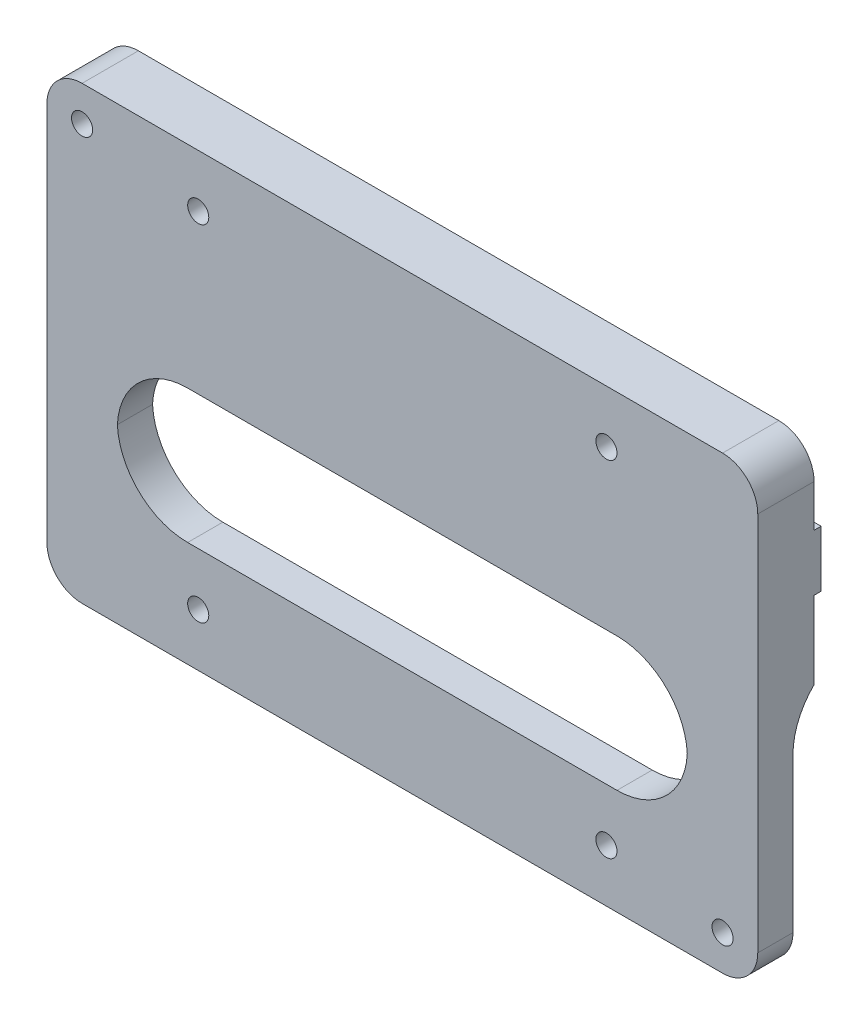
ISO-10303-21;
HEADER;
FILE_DESCRIPTION(('STEP AP214'),'2;1');
FILE_NAME('part.step','',(''),(''),'','','');
FILE_SCHEMA(('AUTOMOTIVE_DESIGN { 1 0 10303 214 1 1 1 1 }'));
ENDSEC;
DATA;
#1=APPLICATION_CONTEXT('core data for automotive mechanical design processes');
#2=APPLICATION_PROTOCOL_DEFINITION('international standard','automotive_design',2000,#1);
#3=PRODUCT_CONTEXT('',#1,'mechanical');
#4=PRODUCT('Part','Part','',(#3));
#5=PRODUCT_RELATED_PRODUCT_CATEGORY('part','',(#4));
#6=PRODUCT_DEFINITION_FORMATION('','',#4);
#7=PRODUCT_DEFINITION_CONTEXT('part definition',#1,'design');
#8=PRODUCT_DEFINITION('design','',#6,#7);
#9=PRODUCT_DEFINITION_SHAPE('','',#8);
#10=(LENGTH_UNIT() NAMED_UNIT(*) SI_UNIT(.MILLI.,.METRE.));
#11=(NAMED_UNIT(*) PLANE_ANGLE_UNIT() SI_UNIT($,.RADIAN.));
#12=(NAMED_UNIT(*) SI_UNIT($,.STERADIAN.) SOLID_ANGLE_UNIT());
#13=UNCERTAINTY_MEASURE_WITH_UNIT(LENGTH_MEASURE(1.E-05),#10,'distance_accuracy_value','');
#14=(GEOMETRIC_REPRESENTATION_CONTEXT(3) GLOBAL_UNCERTAINTY_ASSIGNED_CONTEXT((#13)) GLOBAL_UNIT_ASSIGNED_CONTEXT((#10,
#11,#12)) REPRESENTATION_CONTEXT('',''));
#15=CARTESIAN_POINT('',(0.,0.,0.));
#16=DIRECTION('',(0.,0.,1.));
#17=DIRECTION('',(1.,0.,0.));
#18=AXIS2_PLACEMENT_3D('',#15,#16,#17);
#19=CARTESIAN_POINT('',(0.,0.,0.));
#20=DIRECTION('',(0.,0.,-1.));
#21=DIRECTION('',(-1.,0.,0.));
#22=AXIS2_PLACEMENT_3D('',#19,#20,#21);
#23=PLANE('',#22);
#24=DIRECTION('',(0.,1.,0.));
#25=VECTOR('',#24,1.);
#26=CARTESIAN_POINT('',(50.5,-32.,0.));
#27=LINE('',#26,#25);
#28=CARTESIAN_POINT('',(50.5,2.,0.));
#29=VERTEX_POINT('',#28);
#30=CARTESIAN_POINT('',(50.5,13.,0.));
#31=VERTEX_POINT('',#30);
#32=EDGE_CURVE('E506',#29,#31,#27,.T.);
#33=ORIENTED_EDGE('',*,*,#32,.F.);
#34=DIRECTION('',(1.,0.,0.));
#35=VECTOR('',#34,1.);
#36=CARTESIAN_POINT('',(-40.5,2.,0.));
#37=LINE('',#36,#35);
#38=CARTESIAN_POINT('',(30.5,1.99999999999999,0.));
#39=VERTEX_POINT('',#38);
#40=EDGE_CURVE('E202',#39,#29,#37,.T.);
#41=ORIENTED_EDGE('',*,*,#40,.F.);
#42=CARTESIAN_POINT('',(-30.5,2.,0.));
#43=VERTEX_POINT('',#42);
#44=EDGE_CURVE('E196',#43,#39,#37,.T.);
#45=ORIENTED_EDGE('',*,*,#44,.F.);
#46=CARTESIAN_POINT('',(-50.5,2.,0.));
#47=VERTEX_POINT('',#46);
#48=EDGE_CURVE('E190',#47,#43,#37,.T.);
#49=ORIENTED_EDGE('',*,*,#48,.F.);
#50=DIRECTION('',(0.,-1.,0.));
#51=VECTOR('',#50,1.);
#52=CARTESIAN_POINT('',(-50.5,-32.,0.));
#53=LINE('',#52,#51);
#54=CARTESIAN_POINT('',(-50.5,13.,0.));
#55=VERTEX_POINT('',#54);
#56=EDGE_CURVE('E194',#55,#47,#53,.T.);
#57=ORIENTED_EDGE('',*,*,#56,.F.);
#58=DIRECTION('',(-1.,0.,0.));
#59=VECTOR('',#58,1.);
#60=CARTESIAN_POINT('',(58.5622577482986,13.,0.));
#61=LINE('',#60,#59);
#62=EDGE_CURVE('E456',#31,#55,#61,.T.);
#63=ORIENTED_EDGE('',*,*,#62,.F.);
#64=EDGE_LOOP('',(#33,#41,#45,#49,#57,#63));
#65=FACE_BOUND('',#64,.T.);
#66=ADVANCED_FACE('F39',(#65),#23,.T.);
#67=CARTESIAN_POINT('',(50.5,-32.,8.));
#68=DIRECTION('',(-1.,0.,0.));
#69=DIRECTION('',(0.,0.,1.));
#70=AXIS2_PLACEMENT_3D('',#67,#68,#69);
#71=PLANE('',#70);
#72=DIRECTION('',(0.,1.,0.));
#73=VECTOR('',#72,1.);
#74=CARTESIAN_POINT('',(50.5,2.,3.));
#75=LINE('',#74,#73);
#76=CARTESIAN_POINT('',(50.5,-27.,3.00000000000001));
#77=VERTEX_POINT('',#76);
#78=CARTESIAN_POINT('',(50.5,-5.14142842854286,3.));
#79=VERTEX_POINT('',#78);
#80=EDGE_CURVE('E541',#77,#79,#75,.T.);
#81=ORIENTED_EDGE('',*,*,#80,.T.);
#82=CARTESIAN_POINT('',(50.5,-5.14142842854286,-7.));
#83=DIRECTION('',(-1.,0.,0.));
#84=DIRECTION('',(0.,0.,1.));
#85=AXIS2_PLACEMENT_3D('',#82,#83,#84);
#86=CIRCLE('',#85,10.);
#87=EDGE_CURVE('E54',#79,#29,#86,.T.);
#88=ORIENTED_EDGE('',*,*,#87,.T.);
#89=ORIENTED_EDGE('',*,*,#32,.T.);
#90=DIRECTION('',(0.,0.,-1.));
#91=VECTOR('',#90,1.);
#92=CARTESIAN_POINT('',(50.5,13.,0.));
#93=LINE('',#92,#91);
#94=CARTESIAN_POINT('',(50.5,13.,-1.));
#95=VERTEX_POINT('',#94);
#96=EDGE_CURVE('E445',#31,#95,#93,.T.);
#97=ORIENTED_EDGE('',*,*,#96,.T.);
#98=DIRECTION('',(0.,1.,0.));
#99=VECTOR('',#98,1.);
#100=CARTESIAN_POINT('',(50.5,13.,-1.));
#101=LINE('',#100,#99);
#102=CARTESIAN_POINT('',(50.5,21.,-1.));
#103=VERTEX_POINT('',#102);
#104=EDGE_CURVE('E441',#95,#103,#101,.T.);
#105=ORIENTED_EDGE('',*,*,#104,.T.);
#106=DIRECTION('',(0.,0.,1.));
#107=VECTOR('',#106,1.);
#108=CARTESIAN_POINT('',(50.5,21.,0.));
#109=LINE('',#108,#107);
#110=CARTESIAN_POINT('',(50.5,21.,0.));
#111=VERTEX_POINT('',#110);
#112=EDGE_CURVE('E437',#103,#111,#109,.T.);
#113=ORIENTED_EDGE('',*,*,#112,.T.);
#114=CARTESIAN_POINT('',(50.5,27.,0.));
#115=VERTEX_POINT('',#114);
#116=EDGE_CURVE('E494',#111,#115,#27,.T.);
#117=ORIENTED_EDGE('',*,*,#116,.T.);
#118=DIRECTION('',(0.,0.,-1.));
#119=VECTOR('',#118,1.);
#120=CARTESIAN_POINT('',(50.5,27.,8.));
#121=LINE('',#120,#119);
#122=CARTESIAN_POINT('',(50.5,27.,8.));
#123=VERTEX_POINT('',#122);
#124=EDGE_CURVE('E338',#115,#123,#121,.F.);
#125=ORIENTED_EDGE('',*,*,#124,.T.);
#126=DIRECTION('',(0.,1.,0.));
#127=VECTOR('',#126,1.);
#128=CARTESIAN_POINT('',(50.5,-32.,8.));
#129=LINE('',#128,#127);
#130=CARTESIAN_POINT('',(50.5,-27.,8.));
#131=VERTEX_POINT('',#130);
#132=EDGE_CURVE('E292',#131,#123,#129,.T.);
#133=ORIENTED_EDGE('',*,*,#132,.F.);
#134=DIRECTION('',(0.,0.,-1.));
#135=VECTOR('',#134,1.);
#136=CARTESIAN_POINT('',(50.5,-27.,8.));
#137=LINE('',#136,#135);
#138=EDGE_CURVE('E341',#131,#77,#137,.T.);
#139=ORIENTED_EDGE('',*,*,#138,.T.);
#140=EDGE_LOOP('',(#81,#88,#89,#97,#105,#113,#117,#125,#133,#139));
#141=FACE_BOUND('',#140,.T.);
#142=ADVANCED_FACE('F248',(#141),#71,.F.);
#143=CARTESIAN_POINT('',(-50.5,-32.,8.));
#144=DIRECTION('',(1.,0.,0.));
#145=DIRECTION('',(0.,0.,-1.));
#146=AXIS2_PLACEMENT_3D('',#143,#144,#145);
#147=PLANE('',#146);
#148=ORIENTED_EDGE('',*,*,#56,.T.);
#149=CARTESIAN_POINT('',(-50.5,-5.14142842854285,-7.));
#150=DIRECTION('',(1.,0.,0.));
#151=DIRECTION('',(0.,0.,-1.));
#152=AXIS2_PLACEMENT_3D('',#149,#150,#151);
#153=CIRCLE('',#152,10.);
#154=CARTESIAN_POINT('',(-50.5,-5.14142842854285,3.));
#155=VERTEX_POINT('',#154);
#156=EDGE_CURVE('E207',#47,#155,#153,.T.);
#157=ORIENTED_EDGE('',*,*,#156,.T.);
#158=DIRECTION('',(0.,1.,0.));
#159=VECTOR('',#158,1.);
#160=CARTESIAN_POINT('',(-50.5,2.,3.));
#161=LINE('',#160,#159);
#162=CARTESIAN_POINT('',(-50.5,-27.,3.00000000000001));
#163=VERTEX_POINT('',#162);
#164=EDGE_CURVE('E390',#163,#155,#161,.T.);
#165=ORIENTED_EDGE('',*,*,#164,.F.);
#166=DIRECTION('',(0.,0.,-1.));
#167=VECTOR('',#166,1.);
#168=CARTESIAN_POINT('',(-50.5,-27.,8.));
#169=LINE('',#168,#167);
#170=CARTESIAN_POINT('',(-50.5,-27.,8.));
#171=VERTEX_POINT('',#170);
#172=EDGE_CURVE('E311',#163,#171,#169,.F.);
#173=ORIENTED_EDGE('',*,*,#172,.T.);
#174=DIRECTION('',(0.,-1.,0.));
#175=VECTOR('',#174,1.);
#176=CARTESIAN_POINT('',(-50.5,-32.,8.));
#177=LINE('',#176,#175);
#178=CARTESIAN_POINT('',(-50.5,27.,8.));
#179=VERTEX_POINT('',#178);
#180=EDGE_CURVE('E500',#179,#171,#177,.T.);
#181=ORIENTED_EDGE('',*,*,#180,.F.);
#182=DIRECTION('',(0.,0.,-1.));
#183=VECTOR('',#182,1.);
#184=CARTESIAN_POINT('',(-50.5,27.,8.));
#185=LINE('',#184,#183);
#186=CARTESIAN_POINT('',(-50.5,27.,0.));
#187=VERTEX_POINT('',#186);
#188=EDGE_CURVE('E308',#179,#187,#185,.T.);
#189=ORIENTED_EDGE('',*,*,#188,.T.);
#190=CARTESIAN_POINT('',(-50.5,21.,0.));
#191=VERTEX_POINT('',#190);
#192=EDGE_CURVE('E213',#187,#191,#53,.T.);
#193=ORIENTED_EDGE('',*,*,#192,.T.);
#194=DIRECTION('',(0.,0.,-1.));
#195=VECTOR('',#194,1.);
#196=CARTESIAN_POINT('',(-50.5,21.,0.));
#197=LINE('',#196,#195);
#198=CARTESIAN_POINT('',(-50.5,21.,-1.));
#199=VERTEX_POINT('',#198);
#200=EDGE_CURVE('E450',#191,#199,#197,.T.);
#201=ORIENTED_EDGE('',*,*,#200,.T.);
#202=DIRECTION('',(0.,-1.,0.));
#203=VECTOR('',#202,1.);
#204=CARTESIAN_POINT('',(-50.5,13.,-1.));
#205=LINE('',#204,#203);
#206=CARTESIAN_POINT('',(-50.5,13.,-1.));
#207=VERTEX_POINT('',#206);
#208=EDGE_CURVE('E453',#199,#207,#205,.T.);
#209=ORIENTED_EDGE('',*,*,#208,.T.);
#210=DIRECTION('',(0.,0.,1.));
#211=VECTOR('',#210,1.);
#212=CARTESIAN_POINT('',(-50.5,13.,0.));
#213=LINE('',#212,#211);
#214=EDGE_CURVE('E211',#207,#55,#213,.T.);
#215=ORIENTED_EDGE('',*,*,#214,.T.);
#216=EDGE_LOOP('',(#148,#157,#165,#173,#181,#189,#193,#201,#209,#215));
#217=FACE_BOUND('',#216,.T.);
#218=ADVANCED_FACE('F205',(#217),#147,.F.);
#219=CARTESIAN_POINT('',(-50.5,-32.,8.));
#220=DIRECTION('',(0.,1.,0.));
#221=DIRECTION('',(0.,0.,1.));
#222=AXIS2_PLACEMENT_3D('',#219,#220,#221);
#223=PLANE('',#222);
#224=DIRECTION('',(1.,0.,0.));
#225=VECTOR('',#224,1.);
#226=CARTESIAN_POINT('',(-50.5,-32.,3.00000000000001));
#227=LINE('',#226,#225);
#228=CARTESIAN_POINT('',(-45.5,-32.,3.));
#229=VERTEX_POINT('',#228);
#230=CARTESIAN_POINT('',(45.5,-32.,3.));
#231=VERTEX_POINT('',#230);
#232=EDGE_CURVE('E396',#229,#231,#227,.T.);
#233=ORIENTED_EDGE('',*,*,#232,.T.);
#234=DIRECTION('',(0.,0.,-1.));
#235=VECTOR('',#234,1.);
#236=CARTESIAN_POINT('',(45.5,-32.,8.));
#237=LINE('',#236,#235);
#238=CARTESIAN_POINT('',(45.5,-32.,8.));
#239=VERTEX_POINT('',#238);
#240=EDGE_CURVE('E300',#231,#239,#237,.F.);
#241=ORIENTED_EDGE('',*,*,#240,.T.);
#242=DIRECTION('',(1.,0.,0.));
#243=VECTOR('',#242,1.);
#244=CARTESIAN_POINT('',(-50.5,-32.,8.));
#245=LINE('',#244,#243);
#246=CARTESIAN_POINT('',(-45.5,-32.,8.));
#247=VERTEX_POINT('',#246);
#248=EDGE_CURVE('E304',#247,#239,#245,.T.);
#249=ORIENTED_EDGE('',*,*,#248,.F.);
#250=DIRECTION('',(0.,0.,-1.));
#251=VECTOR('',#250,1.);
#252=CARTESIAN_POINT('',(-45.5,-32.,8.));
#253=LINE('',#252,#251);
#254=EDGE_CURVE('E303',#247,#229,#253,.T.);
#255=ORIENTED_EDGE('',*,*,#254,.T.);
#256=EDGE_LOOP('',(#233,#241,#249,#255));
#257=FACE_BOUND('',#256,.T.);
#258=ADVANCED_FACE('F536',(#257),#223,.F.);
#259=CARTESIAN_POINT('',(29.,-24.5,8.));
#260=DIRECTION('',(0.,0.,-1.));
#261=DIRECTION('',(-1.,0.,0.));
#262=AXIS2_PLACEMENT_3D('',#259,#260,#261);
#263=CYLINDRICAL_SURFACE('',#262,1.5);
#264=CARTESIAN_POINT('',(29.,-24.5,8.));
#265=DIRECTION('',(0.,0.,1.));
#266=DIRECTION('',(1.,0.,0.));
#267=AXIS2_PLACEMENT_3D('',#264,#265,#266);
#268=CIRCLE('',#267,1.5);
#269=CARTESIAN_POINT('',(30.5,-24.5,8.));
#270=VERTEX_POINT('',#269);
#271=EDGE_CURVE('E480',#270,#270,#268,.T.);
#272=ORIENTED_EDGE('',*,*,#271,.T.);
#273=EDGE_LOOP('',(#272));
#274=FACE_BOUND('',#273,.T.);
#275=CARTESIAN_POINT('',(29.,-24.5,3.));
#276=DIRECTION('',(0.,0.,-1.));
#277=DIRECTION('',(0.,1.,0.));
#278=AXIS2_PLACEMENT_3D('',#275,#276,#277);
#279=CIRCLE('',#278,1.5);
#280=CARTESIAN_POINT('',(29.,-23.,3.));
#281=VERTEX_POINT('',#280);
#282=EDGE_CURVE('E377',#281,#281,#279,.T.);
#283=ORIENTED_EDGE('',*,*,#282,.T.);
#284=EDGE_LOOP('',(#283));
#285=FACE_BOUND('',#284,.T.);
#286=ADVANCED_FACE('F598',(#274,#285),#263,.F.);
#287=CARTESIAN_POINT('',(-29.,-24.5,8.));
#288=DIRECTION('',(0.,0.,-1.));
#289=DIRECTION('',(-1.,0.,0.));
#290=AXIS2_PLACEMENT_3D('',#287,#288,#289);
#291=CYLINDRICAL_SURFACE('',#290,1.5);
#292=CARTESIAN_POINT('',(-29.,-24.5,8.));
#293=DIRECTION('',(0.,0.,1.));
#294=DIRECTION('',(1.,0.,0.));
#295=AXIS2_PLACEMENT_3D('',#292,#293,#294);
#296=CIRCLE('',#295,1.5);
#297=CARTESIAN_POINT('',(-27.5,-24.5,8.));
#298=VERTEX_POINT('',#297);
#299=EDGE_CURVE('E476',#298,#298,#296,.T.);
#300=ORIENTED_EDGE('',*,*,#299,.T.);
#301=EDGE_LOOP('',(#300));
#302=FACE_BOUND('',#301,.T.);
#303=CARTESIAN_POINT('',(-29.,-24.5,3.));
#304=DIRECTION('',(0.,0.,-1.));
#305=DIRECTION('',(0.,1.,0.));
#306=AXIS2_PLACEMENT_3D('',#303,#304,#305);
#307=CIRCLE('',#306,1.5);
#308=CARTESIAN_POINT('',(-29.,-23.,3.));
#309=VERTEX_POINT('',#308);
#310=EDGE_CURVE('E423',#309,#309,#307,.T.);
#311=ORIENTED_EDGE('',*,*,#310,.T.);
#312=EDGE_LOOP('',(#311));
#313=FACE_BOUND('',#312,.T.);
#314=ADVANCED_FACE('F594',(#302,#313),#291,.F.);
#315=CARTESIAN_POINT('',(45.5,-27.,8.));
#316=DIRECTION('',(0.,0.,-1.));
#317=DIRECTION('',(-1.,0.,0.));
#318=AXIS2_PLACEMENT_3D('',#315,#316,#317);
#319=CYLINDRICAL_SURFACE('',#318,1.5);
#320=CARTESIAN_POINT('',(45.5,-27.,8.));
#321=DIRECTION('',(0.,0.,1.));
#322=DIRECTION('',(1.,0.,0.));
#323=AXIS2_PLACEMENT_3D('',#320,#321,#322);
#324=CIRCLE('',#323,1.5);
#325=CARTESIAN_POINT('',(47.,-27.,8.));
#326=VERTEX_POINT('',#325);
#327=EDGE_CURVE('E470',#326,#326,#324,.T.);
#328=ORIENTED_EDGE('',*,*,#327,.T.);
#329=EDGE_LOOP('',(#328));
#330=FACE_BOUND('',#329,.T.);
#331=CARTESIAN_POINT('',(45.5,-27.,3.));
#332=DIRECTION('',(0.,0.,-1.));
#333=DIRECTION('',(0.,1.,0.));
#334=AXIS2_PLACEMENT_3D('',#331,#332,#333);
#335=CIRCLE('',#334,1.5);
#336=CARTESIAN_POINT('',(45.5,-25.5,3.));
#337=VERTEX_POINT('',#336);
#338=EDGE_CURVE('E419',#337,#337,#335,.T.);
#339=ORIENTED_EDGE('',*,*,#338,.T.);
#340=EDGE_LOOP('',(#339));
#341=FACE_BOUND('',#340,.T.);
#342=ADVANCED_FACE('F591',(#330,#341),#319,.F.);
#343=CARTESIAN_POINT('',(-45.5,-27.,8.));
#344=DIRECTION('',(0.,0.,-1.));
#345=DIRECTION('',(-1.,0.,0.));
#346=AXIS2_PLACEMENT_3D('',#343,#344,#345);
#347=CYLINDRICAL_SURFACE('',#346,5.);
#348=ORIENTED_EDGE('',*,*,#172,.F.);
#349=CARTESIAN_POINT('',(-45.5,-27.,3.));
#350=DIRECTION('',(0.,0.,-1.));
#351=DIRECTION('',(0.,1.,0.));
#352=AXIS2_PLACEMENT_3D('',#349,#350,#351);
#353=CIRCLE('',#352,5.);
#354=EDGE_CURVE('E415',#163,#229,#353,.F.);
#355=ORIENTED_EDGE('',*,*,#354,.T.);
#356=ORIENTED_EDGE('',*,*,#254,.F.);
#357=CARTESIAN_POINT('',(-45.5,-27.,8.));
#358=DIRECTION('',(0.,0.,-1.));
#359=DIRECTION('',(-1.,0.,0.));
#360=AXIS2_PLACEMENT_3D('',#357,#358,#359);
#361=CIRCLE('',#360,5.);
#362=EDGE_CURVE('E323',#171,#247,#361,.F.);
#363=ORIENTED_EDGE('',*,*,#362,.F.);
#364=EDGE_LOOP('',(#348,#355,#356,#363));
#365=FACE_BOUND('',#364,.T.);
#366=ADVANCED_FACE('F531',(#365),#347,.T.);
#367=CARTESIAN_POINT('',(45.5,-27.,8.));
#368=DIRECTION('',(0.,0.,-1.));
#369=DIRECTION('',(-1.,0.,0.));
#370=AXIS2_PLACEMENT_3D('',#367,#368,#369);
#371=CYLINDRICAL_SURFACE('',#370,5.);
#372=ORIENTED_EDGE('',*,*,#240,.F.);
#373=CARTESIAN_POINT('',(45.5,-27.,3.));
#374=DIRECTION('',(0.,0.,-1.));
#375=DIRECTION('',(0.,1.,0.));
#376=AXIS2_PLACEMENT_3D('',#373,#374,#375);
#377=CIRCLE('',#376,5.);
#378=EDGE_CURVE('E411',#231,#77,#377,.F.);
#379=ORIENTED_EDGE('',*,*,#378,.T.);
#380=ORIENTED_EDGE('',*,*,#138,.F.);
#381=CARTESIAN_POINT('',(45.5,-27.,8.));
#382=DIRECTION('',(0.,0.,-1.));
#383=DIRECTION('',(-1.,0.,0.));
#384=AXIS2_PLACEMENT_3D('',#381,#382,#383);
#385=CIRCLE('',#384,5.);
#386=EDGE_CURVE('E317',#239,#131,#385,.F.);
#387=ORIENTED_EDGE('',*,*,#386,.F.);
#388=EDGE_LOOP('',(#372,#379,#380,#387));
#389=FACE_BOUND('',#388,.T.);
#390=ADVANCED_FACE('F539',(#389),#371,.T.);
#391=CARTESIAN_POINT('',(40.5,-17.,8.));
#392=DIRECTION('',(0.,-1.,0.));
#393=DIRECTION('',(0.,0.,-1.));
#394=AXIS2_PLACEMENT_3D('',#391,#392,#393);
#395=PLANE('',#394);
#396=DIRECTION('',(1.,0.,0.));
#397=VECTOR('',#396,1.);
#398=CARTESIAN_POINT('',(40.5,-17.,3.));
#399=LINE('',#398,#397);
#400=CARTESIAN_POINT('',(-30.5,-17.,3.));
#401=VERTEX_POINT('',#400);
#402=CARTESIAN_POINT('',(30.5,-17.,3.));
#403=VERTEX_POINT('',#402);
#404=EDGE_CURVE('E395',#401,#403,#399,.T.);
#405=ORIENTED_EDGE('',*,*,#404,.F.);
#406=DIRECTION('',(0.,0.,-1.));
#407=VECTOR('',#406,1.);
#408=CARTESIAN_POINT('',(-30.5,-17.,8.));
#409=LINE('',#408,#407);
#410=CARTESIAN_POINT('',(-30.5,-17.,8.));
#411=VERTEX_POINT('',#410);
#412=EDGE_CURVE('E345',#401,#411,#409,.F.);
#413=ORIENTED_EDGE('',*,*,#412,.T.);
#414=DIRECTION('',(-1.,0.,0.));
#415=VECTOR('',#414,1.);
#416=CARTESIAN_POINT('',(40.5,-17.,8.));
#417=LINE('',#416,#415);
#418=CARTESIAN_POINT('',(30.5,-17.,8.));
#419=VERTEX_POINT('',#418);
#420=EDGE_CURVE('E433',#419,#411,#417,.T.);
#421=ORIENTED_EDGE('',*,*,#420,.F.);
#422=DIRECTION('',(0.,0.,-1.));
#423=VECTOR('',#422,1.);
#424=CARTESIAN_POINT('',(30.5,-17.,0.));
#425=LINE('',#424,#423);
#426=EDGE_CURVE('E348',#419,#403,#425,.T.);
#427=ORIENTED_EDGE('',*,*,#426,.T.);
#428=EDGE_LOOP('',(#405,#413,#421,#427));
#429=FACE_BOUND('',#428,.T.);
#430=ADVANCED_FACE('F561',(#429),#395,.F.);
#431=CARTESIAN_POINT('',(30.5,-8.00000000000001,8.));
#432=DIRECTION('',(0.,0.,1.));
#433=DIRECTION('',(1.,0.,0.));
#434=AXIS2_PLACEMENT_3D('',#431,#432,#433);
#435=CYLINDRICAL_SURFACE('',#434,10.);
#436=CARTESIAN_POINT('',(30.5,-8.00000000000001,3.));
#437=DIRECTION('',(0.,0.,-1.));
#438=DIRECTION('',(0.,1.,0.));
#439=AXIS2_PLACEMENT_3D('',#436,#437,#438);
#440=CIRCLE('',#439,10.);
#441=CARTESIAN_POINT('',(40.4874921777191,-7.5,3.));
#442=VERTEX_POINT('',#441);
#443=CARTESIAN_POINT('',(40.0827223987162,-5.14142842854286,3.));
#444=VERTEX_POINT('',#443);
#445=EDGE_CURVE('E408',#442,#444,#440,.F.);
#446=ORIENTED_EDGE('',*,*,#445,.F.);
#447=DIRECTION('',(0.,0.,1.));
#448=VECTOR('',#447,1.);
#449=CARTESIAN_POINT('',(40.4874921777191,-7.5,4.));
#450=LINE('',#449,#448);
#451=CARTESIAN_POINT('',(40.4874921777191,-7.5,8.));
#452=VERTEX_POINT('',#451);
#453=EDGE_CURVE('E370',#452,#442,#450,.F.);
#454=ORIENTED_EDGE('',*,*,#453,.F.);
#455=CARTESIAN_POINT('',(30.5,-8.00000000000001,8.));
#456=DIRECTION('',(0.,0.,-1.));
#457=DIRECTION('',(-1.,0.,0.));
#458=AXIS2_PLACEMENT_3D('',#455,#456,#457);
#459=CIRCLE('',#458,10.);
#460=CARTESIAN_POINT('',(30.5,1.99999999999999,8.));
#461=VERTEX_POINT('',#460);
#462=EDGE_CURVE('E363',#461,#452,#459,.T.);
#463=ORIENTED_EDGE('',*,*,#462,.F.);
#464=DIRECTION('',(0.,0.,-1.));
#465=VECTOR('',#464,1.);
#466=CARTESIAN_POINT('',(30.5,1.99999999999999,8.));
#467=LINE('',#466,#465);
#468=EDGE_CURVE('E60',#39,#461,#467,.F.);
#469=ORIENTED_EDGE('',*,*,#468,.F.);
#470=CARTESIAN_POINT('',(30.5,1.99999999999999,0.));
#471=CARTESIAN_POINT('',(30.6228988848282,2.00000264565104,-1.0017859295357E-05));
#472=CARTESIAN_POINT('',(30.7457740641944,1.99773367179414,0.00231287856507868));
#473=CARTESIAN_POINT('',(30.9911661058106,1.98868469639766,0.0115297268458258));
#474=CARTESIAN_POINT('',(31.1136830254385,1.98190546201616,0.0184229013349358));
#475=CARTESIAN_POINT('',(31.4797273206742,1.95489124646632,0.0457746745760189));
#476=CARTESIAN_POINT('',(31.7223196529861,1.92797942267466,0.0729063979828144));
#477=CARTESIAN_POINT('',(32.1996054835134,1.85742834544419,0.142716407901489));
#478=CARTESIAN_POINT('',(32.4343591268334,1.81399618482417,0.185201908663989));
#479=CARTESIAN_POINT('',(32.8976356169773,1.71121371305961,0.283291187642606));
#480=CARTESIAN_POINT('',(33.1261553841984,1.65185568581438,0.338901323183387));
#481=CARTESIAN_POINT('',(33.574092980991,1.5186208768608,0.460011495084229));
#482=CARTESIAN_POINT('',(33.7935682066353,1.44486180313861,0.525430414570318));
#483=CARTESIAN_POINT('',(34.2247493939678,1.28327793523941,0.663841050305039));
#484=CARTESIAN_POINT('',(34.4364561859465,1.19545464965973,0.736831954049537));
#485=CARTESIAN_POINT('',(34.8526543726027,1.00593669828319,0.888261548701366));
#486=CARTESIAN_POINT('',(35.0571136978275,0.90418821754529,0.966720764858929));
#487=CARTESIAN_POINT('',(35.4577326097809,0.687505838015745,1.12660209361018));
#488=CARTESIAN_POINT('',(35.6538910790906,0.572570171712336,1.20802460238049));
#489=CARTESIAN_POINT('',(36.0766890636354,0.305130566542656,1.38844600442725));
#490=CARTESIAN_POINT('',(36.3014200174113,0.149739010860142,1.48765355670536));
#491=CARTESIAN_POINT('',(36.7379877173952,-0.179370781048551,1.68416566347616));
#492=CARTESIAN_POINT('',(36.9498223098834,-0.353092065210859,1.78146989827924));
#493=CARTESIAN_POINT('',(37.359542116515,-0.718384275254619,1.97100792909635));
#494=CARTESIAN_POINT('',(37.557441184113,-0.909937021796664,2.06324674002758));
#495=CARTESIAN_POINT('',(37.9383627837981,-1.31067012716215,2.23976201956093));
#496=CARTESIAN_POINT('',(38.1213890707859,-1.51984600937515,2.32404049876955));
#497=CARTESIAN_POINT('',(38.4377870694135,-1.91373562790021,2.46663199171273));
#498=CARTESIAN_POINT('',(38.5739729718015,-2.09551028717227,2.52683204038452));
#499=CARTESIAN_POINT('',(38.8347090128115,-2.4696676520774,2.6384529253531));
#500=CARTESIAN_POINT('',(38.9592656655555,-2.66204432178008,2.68987869008542));
#501=CARTESIAN_POINT('',(39.1955728631579,-3.05634513725339,2.78229729447365));
#502=CARTESIAN_POINT('',(39.3073503368856,-3.25824789078401,2.82331230348522));
#503=CARTESIAN_POINT('',(39.5173350274121,-3.67088711777503,2.89349651003509));
#504=CARTESIAN_POINT('',(39.6155492468691,-3.88161895900366,2.92267183555628));
#505=CARTESIAN_POINT('',(39.7785910511445,-4.26612367402883,2.96308428066189));
#506=CARTESIAN_POINT('',(39.8461184028111,-4.43849753191529,2.9767867828558));
#507=CARTESIAN_POINT('',(39.9716649413543,-4.78721061641525,2.99525459198074));
#508=CARTESIAN_POINT('',(40.0296805227887,-4.96355131799371,3.00001651709585));
#509=CARTESIAN_POINT('',(40.0827223987162,-5.14142842854286,3.));
#510=B_SPLINE_CURVE_WITH_KNOTS('',3,(#470,#471,#472,#473,#474,#475,#476,#477,#478,#479,#480,
#481,#482,#483,#484,#485,#486,#487,#488,#489,#490,#491,#492,#493,#494,#495,#496,#497,#498,#499,
#500,#501,#502,#503,#504,#505,#506,#507,#508,#509),.UNSPECIFIED.,.F.,.F.,(4,2,2,2,2,2,2,2,2,2,2,
2,2,2,2,2,2,2,2,4),(0.,0.368608087834073,0.737153494498483,1.47253848700171,2.19899355457705,
2.92580122805044,3.6468997934408,4.3679210619563,5.09181188584964,5.81579984825066,
6.68694449785286,7.55823423363505,8.42864521202791,9.2988357523443,10.0031279127376,
10.7070231669187,11.4094066811334,12.1114261906244,12.6678506639744,13.2244855651659),.UNSPECIFIED.);
#511=EDGE_CURVE('E11',#39,#444,#510,.T.);
#512=ORIENTED_EDGE('',*,*,#511,.T.);
#513=EDGE_LOOP('',(#446,#454,#463,#469,#512));
#514=FACE_BOUND('',#513,.T.);
#515=ADVANCED_FACE('F552',(#514),#435,.F.);
#516=CARTESIAN_POINT('',(30.5,-6.99999999999999,8.));
#517=DIRECTION('',(0.,0.,1.));
#518=DIRECTION('',(1.,0.,0.));
#519=AXIS2_PLACEMENT_3D('',#516,#517,#518);
#520=CYLINDRICAL_SURFACE('',#519,10.);
#521=CARTESIAN_POINT('',(30.5,-6.99999999999999,3.));
#522=DIRECTION('',(0.,0.,-1.));
#523=DIRECTION('',(0.,1.,0.));
#524=AXIS2_PLACEMENT_3D('',#521,#522,#523);
#525=CIRCLE('',#524,10.);
#526=EDGE_CURVE('E400',#403,#442,#525,.F.);
#527=ORIENTED_EDGE('',*,*,#526,.F.);
#528=ORIENTED_EDGE('',*,*,#426,.F.);
#529=CARTESIAN_POINT('',(30.5,-6.99999999999999,8.));
#530=DIRECTION('',(0.,0.,-1.));
#531=DIRECTION('',(-1.,0.,0.));
#532=AXIS2_PLACEMENT_3D('',#529,#530,#531);
#533=CIRCLE('',#532,10.);
#534=EDGE_CURVE('E356',#452,#419,#533,.T.);
#535=ORIENTED_EDGE('',*,*,#534,.F.);
#536=ORIENTED_EDGE('',*,*,#453,.T.);
#537=EDGE_LOOP('',(#527,#528,#535,#536));
#538=FACE_BOUND('',#537,.T.);
#539=ADVANCED_FACE('F557',(#538),#520,.F.);
#540=CARTESIAN_POINT('',(-30.5,-8.,8.));
#541=DIRECTION('',(0.,0.,1.));
#542=DIRECTION('',(1.,0.,0.));
#543=AXIS2_PLACEMENT_3D('',#540,#541,#542);
#544=CYLINDRICAL_SURFACE('',#543,10.);
#545=CARTESIAN_POINT('',(-30.5,-8.,3.));
#546=DIRECTION('',(0.,0.,-1.));
#547=DIRECTION('',(0.,1.,0.));
#548=AXIS2_PLACEMENT_3D('',#545,#546,#547);
#549=CIRCLE('',#548,10.);
#550=CARTESIAN_POINT('',(-40.0827223987162,-5.14142842854285,3.));
#551=VERTEX_POINT('',#550);
#552=CARTESIAN_POINT('',(-40.4874921777191,-7.5,3.));
#553=VERTEX_POINT('',#552);
#554=EDGE_CURVE('E388',#551,#553,#549,.F.);
#555=ORIENTED_EDGE('',*,*,#554,.F.);
#556=CARTESIAN_POINT('',(-40.0827223987162,-5.14142842854285,3.));
#557=CARTESIAN_POINT('',(-40.0472518702056,-5.02251422459277,3.00000188371458));
#558=CARTESIAN_POINT('',(-40.009570394094,-4.90428505052088,2.99787843711905));
#559=CARTESIAN_POINT('',(-39.9298905667417,-4.66945487735272,2.98954643910367));
#560=CARTESIAN_POINT('',(-39.8878928582245,-4.55285363877171,2.98333849515859));
#561=CARTESIAN_POINT('',(-39.7557049167234,-4.20619030614329,2.95886090972932));
#562=CARTESIAN_POINT('',(-39.6592075580045,-3.97889274223336,2.9347364610162));
#563=CARTESIAN_POINT('',(-39.4515268395312,-3.53574905295033,2.87276183890375));
#564=CARTESIAN_POINT('',(-39.3404878419114,-3.31981633556919,2.83504091635858));
#565=CARTESIAN_POINT('',(-39.1041733956406,-2.89837430649486,2.7475658707399));
#566=CARTESIAN_POINT('',(-38.9788935638698,-2.69286823227142,2.69780803753697));
#567=CARTESIAN_POINT('',(-38.7159784997707,-2.29435517198486,2.58835974061784));
#568=CARTESIAN_POINT('',(-38.578411869112,-2.10128801618164,2.5287230109136));
#569=CARTESIAN_POINT('',(-38.2914742082672,-1.72715843113693,2.40116304940688));
#570=CARTESIAN_POINT('',(-38.1421040215117,-1.54609514584845,2.3332404094911));
#571=CARTESIAN_POINT('',(-37.6767418013007,-1.02048377994055,2.11926104397351));
#572=CARTESIAN_POINT('',(-37.3440787573061,-0.694386370277164,1.96324655944179));
#573=CARTESIAN_POINT('',(-36.7907447324543,-0.222014098173671,1.70849208494301));
#574=CARTESIAN_POINT('',(-36.5827022966796,-0.0582947114959616,1.6136513974721));
#575=CARTESIAN_POINT('',(-36.1545578918162,0.252019522362365,1.42281644475005));
#576=CARTESIAN_POINT('',(-35.9344539754551,0.398611592377226,1.32682199519369));
#577=CARTESIAN_POINT('',(-35.4827501081737,0.674228214774787,1.13671812442121));
#578=CARTESIAN_POINT('',(-35.2511500452807,0.803252596002054,1.04260872157802));
#579=CARTESIAN_POINT('',(-34.7768066016921,1.04320360111881,0.8595849901988));
#580=CARTESIAN_POINT('',(-34.5340659070296,1.15413455830848,0.770669421045088));
#581=CARTESIAN_POINT('',(-34.084904982821,1.33786022526506,0.617760848217472));
#582=CARTESIAN_POINT('',(-33.8803294553718,1.41389745183639,0.552239663680583));
#583=CARTESIAN_POINT('',(-33.4644254779343,1.55302335349691,0.429195244285887));
#584=CARTESIAN_POINT('',(-33.2530967750652,1.61611154303533,0.371672309364975));
#585=CARTESIAN_POINT('',(-32.8250353517326,1.72846327129527,0.267081258854856));
#586=CARTESIAN_POINT('',(-32.6083233797518,1.77777295106194,0.219978362115804));
#587=CARTESIAN_POINT('',(-32.1699138509476,1.86210799208897,0.13820300502131));
#588=CARTESIAN_POINT('',(-31.9482190338279,1.89714100967696,0.103523883219387));
#589=CARTESIAN_POINT('',(-31.5228186979766,1.94963331637473,0.0511055827155993));
#590=CARTESIAN_POINT('',(-31.3194482489223,1.9684650849326,0.0320519384912253));
#591=CARTESIAN_POINT('',(-31.0130459105386,1.9873570714884,0.0128801958062349));
#592=CARTESIAN_POINT('',(-30.9105644272518,1.99209516770898,0.00805762153498986));
#593=CARTESIAN_POINT('',(-30.7053929280322,1.998417495487,0.00161484226953293));
#594=CARTESIAN_POINT('',(-30.6027028908611,2.00000138785836,-5.01832198724188E-06));
#595=CARTESIAN_POINT('',(-30.5,2.,0.));
#596=B_SPLINE_CURVE_WITH_KNOTS('',3,(#556,#557,#558,#559,#560,#561,#562,#563,#564,#565,#566,
#567,#568,#569,#570,#571,#572,#573,#574,#575,#576,#577,#578,#579,#580,#581,#582,#583,#584,#585,
#586,#587,#588,#589,#590,#591,#592,#593,#594,#595),.UNSPECIFIED.,.F.,.F.,(4,2,2,2,2,2,2,2,2,2,2,
2,2,2,2,2,2,2,2,4),(0.,0.372189838502889,0.744324334861093,1.48742165475032,2.22363359247806,
2.9600727421316,3.69263035535058,4.42513567045418,5.8933497586605,6.7363890362731,
7.57956482213846,8.42274882216298,9.26573058564545,9.94880768900154,10.6319104010609,
11.3126973697035,11.9931187620593,12.6076999314478,12.9157255020199,13.2237841942125),.UNSPECIFIED.);
#597=EDGE_CURVE('E221',#551,#43,#596,.T.);
#598=ORIENTED_EDGE('',*,*,#597,.T.);
#599=DIRECTION('',(0.,0.,-1.));
#600=VECTOR('',#599,1.);
#601=CARTESIAN_POINT('',(-30.5,2.,0.));
#602=LINE('',#601,#600);
#603=CARTESIAN_POINT('',(-30.5,2.,8.));
#604=VERTEX_POINT('',#603);
#605=EDGE_CURVE('E68',#604,#43,#602,.T.);
#606=ORIENTED_EDGE('',*,*,#605,.F.);
#607=CARTESIAN_POINT('',(-30.5,-8.,8.));
#608=DIRECTION('',(0.,0.,-1.));
#609=DIRECTION('',(-1.,0.,0.));
#610=AXIS2_PLACEMENT_3D('',#607,#608,#609);
#611=CIRCLE('',#610,10.);
#612=CARTESIAN_POINT('',(-40.4874921777191,-7.5,8.));
#613=VERTEX_POINT('',#612);
#614=EDGE_CURVE('E366',#613,#604,#611,.T.);
#615=ORIENTED_EDGE('',*,*,#614,.F.);
#616=DIRECTION('',(0.,0.,1.));
#617=VECTOR('',#616,1.);
#618=CARTESIAN_POINT('',(-40.4874921777191,-7.5,4.));
#619=LINE('',#618,#617);
#620=EDGE_CURVE('E374',#553,#613,#619,.T.);
#621=ORIENTED_EDGE('',*,*,#620,.F.);
#622=EDGE_LOOP('',(#555,#598,#606,#615,#621));
#623=FACE_BOUND('',#622,.T.);
#624=ADVANCED_FACE('F233',(#623),#544,.F.);
#625=CARTESIAN_POINT('',(-30.5,-6.99999999999999,8.));
#626=DIRECTION('',(0.,0.,1.));
#627=DIRECTION('',(1.,0.,0.));
#628=AXIS2_PLACEMENT_3D('',#625,#626,#627);
#629=CYLINDRICAL_SURFACE('',#628,10.);
#630=CARTESIAN_POINT('',(-30.5,-6.99999999999999,3.));
#631=DIRECTION('',(0.,0.,-1.));
#632=DIRECTION('',(0.,1.,0.));
#633=AXIS2_PLACEMENT_3D('',#630,#631,#632);
#634=CIRCLE('',#633,10.);
#635=EDGE_CURVE('E369',#553,#401,#634,.F.);
#636=ORIENTED_EDGE('',*,*,#635,.F.);
#637=ORIENTED_EDGE('',*,*,#620,.T.);
#638=CARTESIAN_POINT('',(-30.5,-6.99999999999999,8.));
#639=DIRECTION('',(0.,0.,-1.));
#640=DIRECTION('',(-1.,0.,0.));
#641=AXIS2_PLACEMENT_3D('',#638,#639,#640);
#642=CIRCLE('',#641,10.);
#643=EDGE_CURVE('E359',#411,#613,#642,.T.);
#644=ORIENTED_EDGE('',*,*,#643,.F.);
#645=ORIENTED_EDGE('',*,*,#412,.F.);
#646=EDGE_LOOP('',(#636,#637,#644,#645));
#647=FACE_BOUND('',#646,.T.);
#648=ADVANCED_FACE('F260',(#647),#629,.F.);
#649=CARTESIAN_POINT('',(-45.5,27.,0.));
#650=DIRECTION('',(0.,0.,1.));
#651=DIRECTION('',(1.,0.,0.));
#652=AXIS2_PLACEMENT_3D('',#649,#650,#651);
#653=CIRCLE('',#652,1.5);
#654=CARTESIAN_POINT('',(-44.,27.,0.));
#655=VERTEX_POINT('',#654);
#656=EDGE_CURVE('E272',#655,#655,#653,.T.);
#657=ORIENTED_EDGE('',*,*,#656,.T.);
#658=EDGE_LOOP('',(#657));
#659=FACE_BOUND('',#658,.T.);
#660=CARTESIAN_POINT('',(29.,24.5,0.));
#661=DIRECTION('',(0.,0.,1.));
#662=DIRECTION('',(1.,0.,0.));
#663=AXIS2_PLACEMENT_3D('',#660,#661,#662);
#664=CIRCLE('',#663,1.5);
#665=CARTESIAN_POINT('',(30.5,24.5,0.));
#666=VERTEX_POINT('',#665);
#667=EDGE_CURVE('E276',#666,#666,#664,.T.);
#668=ORIENTED_EDGE('',*,*,#667,.T.);
#669=EDGE_LOOP('',(#668));
#670=FACE_BOUND('',#669,.T.);
#671=CARTESIAN_POINT('',(-29.,24.5,0.));
#672=DIRECTION('',(0.,0.,1.));
#673=DIRECTION('',(1.,0.,0.));
#674=AXIS2_PLACEMENT_3D('',#671,#672,#673);
#675=CIRCLE('',#674,1.5);
#676=CARTESIAN_POINT('',(-27.5,24.5,0.));
#677=VERTEX_POINT('',#676);
#678=EDGE_CURVE('E280',#677,#677,#675,.T.);
#679=ORIENTED_EDGE('',*,*,#678,.T.);
#680=EDGE_LOOP('',(#679));
#681=FACE_BOUND('',#680,.T.);
#682=ORIENTED_EDGE('',*,*,#192,.F.);
#683=CARTESIAN_POINT('',(-45.5,27.,0.));
#684=DIRECTION('',(0.,0.,-1.));
#685=DIRECTION('',(-1.,0.,0.));
#686=AXIS2_PLACEMENT_3D('',#683,#684,#685);
#687=CIRCLE('',#686,5.);
#688=CARTESIAN_POINT('',(-45.5,32.,0.));
#689=VERTEX_POINT('',#688);
#690=EDGE_CURVE('E284',#187,#689,#687,.T.);
#691=ORIENTED_EDGE('',*,*,#690,.T.);
#692=DIRECTION('',(-1.,0.,0.));
#693=VECTOR('',#692,1.);
#694=CARTESIAN_POINT('',(-50.5,32.,0.));
#695=LINE('',#694,#693);
#696=CARTESIAN_POINT('',(45.5,32.,0.));
#697=VERTEX_POINT('',#696);
#698=EDGE_CURVE('E214',#697,#689,#695,.T.);
#699=ORIENTED_EDGE('',*,*,#698,.F.);
#700=CARTESIAN_POINT('',(45.5,27.,0.));
#701=DIRECTION('',(0.,0.,-1.));
#702=DIRECTION('',(-1.,0.,0.));
#703=AXIS2_PLACEMENT_3D('',#700,#701,#702);
#704=CIRCLE('',#703,5.);
#705=EDGE_CURVE('E326',#697,#115,#704,.T.);
#706=ORIENTED_EDGE('',*,*,#705,.T.);
#707=ORIENTED_EDGE('',*,*,#116,.F.);
#708=DIRECTION('',(-1.,0.,0.));
#709=VECTOR('',#708,1.);
#710=CARTESIAN_POINT('',(58.5622577482986,21.,0.));
#711=LINE('',#710,#709);
#712=EDGE_CURVE('E287',#111,#191,#711,.T.);
#713=ORIENTED_EDGE('',*,*,#712,.T.);
#714=EDGE_LOOP('',(#682,#691,#699,#706,#707,#713));
#715=FACE_BOUND('',#714,.T.);
#716=ADVANCED_FACE('F250',(#659,#670,#681,#715),#23,.T.);
#717=CARTESIAN_POINT('',(0.,0.,8.));
#718=DIRECTION('',(0.,0.,-1.));
#719=DIRECTION('',(-1.,0.,0.));
#720=AXIS2_PLACEMENT_3D('',#717,#718,#719);
#721=PLANE('',#720);
#722=DIRECTION('',(1.,0.,0.));
#723=VECTOR('',#722,1.);
#724=CARTESIAN_POINT('',(-40.5,2.,8.));
#725=LINE('',#724,#723);
#726=EDGE_CURVE('E200',#604,#461,#725,.T.);
#727=ORIENTED_EDGE('',*,*,#726,.T.);
#728=ORIENTED_EDGE('',*,*,#462,.T.);
#729=ORIENTED_EDGE('',*,*,#534,.T.);
#730=ORIENTED_EDGE('',*,*,#420,.T.);
#731=ORIENTED_EDGE('',*,*,#643,.T.);
#732=ORIENTED_EDGE('',*,*,#614,.T.);
#733=EDGE_LOOP('',(#727,#728,#729,#730,#731,#732));
#734=FACE_BOUND('',#733,.T.);
#735=ORIENTED_EDGE('',*,*,#180,.T.);
#736=ORIENTED_EDGE('',*,*,#362,.T.);
#737=ORIENTED_EDGE('',*,*,#248,.T.);
#738=ORIENTED_EDGE('',*,*,#386,.T.);
#739=ORIENTED_EDGE('',*,*,#132,.T.);
#740=CARTESIAN_POINT('',(45.5,27.,8.));
#741=DIRECTION('',(0.,0.,-1.));
#742=DIRECTION('',(-1.,0.,0.));
#743=AXIS2_PLACEMENT_3D('',#740,#741,#742);
#744=CIRCLE('',#743,5.);
#745=CARTESIAN_POINT('',(45.5,32.,8.));
#746=VERTEX_POINT('',#745);
#747=EDGE_CURVE('E314',#123,#746,#744,.F.);
#748=ORIENTED_EDGE('',*,*,#747,.T.);
#749=DIRECTION('',(-1.,0.,0.));
#750=VECTOR('',#749,1.);
#751=CARTESIAN_POINT('',(-50.5,32.,8.));
#752=LINE('',#751,#750);
#753=CARTESIAN_POINT('',(-45.5,32.,8.));
#754=VERTEX_POINT('',#753);
#755=EDGE_CURVE('E295',#746,#754,#752,.T.);
#756=ORIENTED_EDGE('',*,*,#755,.T.);
#757=CARTESIAN_POINT('',(-45.5,27.,8.));
#758=DIRECTION('',(0.,0.,-1.));
#759=DIRECTION('',(-1.,0.,0.));
#760=AXIS2_PLACEMENT_3D('',#757,#758,#759);
#761=CIRCLE('',#760,5.);
#762=EDGE_CURVE('E320',#754,#179,#761,.F.);
#763=ORIENTED_EDGE('',*,*,#762,.T.);
#764=EDGE_LOOP('',(#735,#736,#737,#738,#739,#748,#756,#763));
#765=FACE_BOUND('',#764,.T.);
#766=CARTESIAN_POINT('',(-29.,24.5,8.));
#767=DIRECTION('',(0.,0.,1.));
#768=DIRECTION('',(1.,0.,0.));
#769=AXIS2_PLACEMENT_3D('',#766,#767,#768);
#770=CIRCLE('',#769,1.5);
#771=CARTESIAN_POINT('',(-27.5,24.5,8.));
#772=VERTEX_POINT('',#771);
#773=EDGE_CURVE('E490',#772,#772,#770,.T.);
#774=ORIENTED_EDGE('',*,*,#773,.F.);
#775=EDGE_LOOP('',(#774));
#776=FACE_BOUND('',#775,.T.);
#777=CARTESIAN_POINT('',(29.,24.5,8.));
#778=DIRECTION('',(0.,0.,1.));
#779=DIRECTION('',(1.,0.,0.));
#780=AXIS2_PLACEMENT_3D('',#777,#778,#779);
#781=CIRCLE('',#780,1.5);
#782=CARTESIAN_POINT('',(30.5,24.5,8.));
#783=VERTEX_POINT('',#782);
#784=EDGE_CURVE('E484',#783,#783,#781,.T.);
#785=ORIENTED_EDGE('',*,*,#784,.F.);
#786=EDGE_LOOP('',(#785));
#787=FACE_BOUND('',#786,.T.);
#788=ORIENTED_EDGE('',*,*,#271,.F.);
#789=EDGE_LOOP('',(#788));
#790=FACE_BOUND('',#789,.T.);
#791=ORIENTED_EDGE('',*,*,#299,.F.);
#792=EDGE_LOOP('',(#791));
#793=FACE_BOUND('',#792,.T.);
#794=ORIENTED_EDGE('',*,*,#327,.F.);
#795=EDGE_LOOP('',(#794));
#796=FACE_BOUND('',#795,.T.);
#797=CARTESIAN_POINT('',(-45.5,27.,8.));
#798=DIRECTION('',(0.,0.,1.));
#799=DIRECTION('',(1.,0.,0.));
#800=AXIS2_PLACEMENT_3D('',#797,#798,#799);
#801=CIRCLE('',#800,1.5);
#802=CARTESIAN_POINT('',(-44.,27.,8.));
#803=VERTEX_POINT('',#802);
#804=EDGE_CURVE('E466',#803,#803,#801,.T.);
#805=ORIENTED_EDGE('',*,*,#804,.F.);
#806=EDGE_LOOP('',(#805));
#807=FACE_BOUND('',#806,.T.);
#808=ADVANCED_FACE('F259',(#734,#765,#776,#787,#790,#793,#796,#807),#721,.F.);
#809=CARTESIAN_POINT('',(-50.5,32.,8.));
#810=DIRECTION('',(0.,-1.,0.));
#811=DIRECTION('',(0.,0.,-1.));
#812=AXIS2_PLACEMENT_3D('',#809,#810,#811);
#813=PLANE('',#812);
#814=ORIENTED_EDGE('',*,*,#698,.T.);
#815=DIRECTION('',(0.,0.,-1.));
#816=VECTOR('',#815,1.);
#817=CARTESIAN_POINT('',(-45.5,32.,8.));
#818=LINE('',#817,#816);
#819=EDGE_CURVE('E335',#689,#754,#818,.F.);
#820=ORIENTED_EDGE('',*,*,#819,.T.);
#821=ORIENTED_EDGE('',*,*,#755,.F.);
#822=DIRECTION('',(0.,0.,-1.));
#823=VECTOR('',#822,1.);
#824=CARTESIAN_POINT('',(45.5,32.,8.));
#825=LINE('',#824,#823);
#826=EDGE_CURVE('E331',#746,#697,#825,.T.);
#827=ORIENTED_EDGE('',*,*,#826,.T.);
#828=EDGE_LOOP('',(#814,#820,#821,#827));
#829=FACE_BOUND('',#828,.T.);
#830=ADVANCED_FACE('F266',(#829),#813,.F.);
#831=CARTESIAN_POINT('',(-29.,24.5,8.));
#832=DIRECTION('',(0.,0.,-1.));
#833=DIRECTION('',(-1.,0.,0.));
#834=AXIS2_PLACEMENT_3D('',#831,#832,#833);
#835=CYLINDRICAL_SURFACE('',#834,1.5);
#836=ORIENTED_EDGE('',*,*,#773,.T.);
#837=EDGE_LOOP('',(#836));
#838=FACE_BOUND('',#837,.T.);
#839=ORIENTED_EDGE('',*,*,#678,.F.);
#840=EDGE_LOOP('',(#839));
#841=FACE_BOUND('',#840,.T.);
#842=ADVANCED_FACE('F605',(#838,#841),#835,.F.);
#843=CARTESIAN_POINT('',(29.,24.5,8.));
#844=DIRECTION('',(0.,0.,-1.));
#845=DIRECTION('',(-1.,0.,0.));
#846=AXIS2_PLACEMENT_3D('',#843,#844,#845);
#847=CYLINDRICAL_SURFACE('',#846,1.5);
#848=ORIENTED_EDGE('',*,*,#784,.T.);
#849=EDGE_LOOP('',(#848));
#850=FACE_BOUND('',#849,.T.);
#851=ORIENTED_EDGE('',*,*,#667,.F.);
#852=EDGE_LOOP('',(#851));
#853=FACE_BOUND('',#852,.T.);
#854=ADVANCED_FACE('F589',(#850,#853),#847,.F.);
#855=CARTESIAN_POINT('',(-45.5,27.,8.));
#856=DIRECTION('',(0.,0.,-1.));
#857=DIRECTION('',(-1.,0.,0.));
#858=AXIS2_PLACEMENT_3D('',#855,#856,#857);
#859=CYLINDRICAL_SURFACE('',#858,1.5);
#860=ORIENTED_EDGE('',*,*,#804,.T.);
#861=EDGE_LOOP('',(#860));
#862=FACE_BOUND('',#861,.T.);
#863=ORIENTED_EDGE('',*,*,#656,.F.);
#864=EDGE_LOOP('',(#863));
#865=FACE_BOUND('',#864,.T.);
#866=ADVANCED_FACE('F585',(#862,#865),#859,.F.);
#867=CARTESIAN_POINT('',(58.5622577482986,13.,0.));
#868=DIRECTION('',(0.,-1.,0.));
#869=DIRECTION('',(0.,0.,-1.));
#870=AXIS2_PLACEMENT_3D('',#867,#868,#869);
#871=PLANE('',#870);
#872=ORIENTED_EDGE('',*,*,#96,.F.);
#873=ORIENTED_EDGE('',*,*,#62,.T.);
#874=ORIENTED_EDGE('',*,*,#214,.F.);
#875=DIRECTION('',(-1.,0.,0.));
#876=VECTOR('',#875,1.);
#877=CARTESIAN_POINT('',(58.5622577482986,13.,-1.));
#878=LINE('',#877,#876);
#879=EDGE_CURVE('E442',#95,#207,#878,.T.);
#880=ORIENTED_EDGE('',*,*,#879,.F.);
#881=EDGE_LOOP('',(#872,#873,#874,#880));
#882=FACE_BOUND('',#881,.T.);
#883=ADVANCED_FACE('F578',(#882),#871,.T.);
#884=CARTESIAN_POINT('',(58.5622577482986,13.,-1.));
#885=DIRECTION('',(0.,0.,-1.));
#886=DIRECTION('',(-1.,0.,0.));
#887=AXIS2_PLACEMENT_3D('',#884,#885,#886);
#888=PLANE('',#887);
#889=ORIENTED_EDGE('',*,*,#104,.F.);
#890=ORIENTED_EDGE('',*,*,#879,.T.);
#891=ORIENTED_EDGE('',*,*,#208,.F.);
#892=DIRECTION('',(-1.,0.,0.));
#893=VECTOR('',#892,1.);
#894=CARTESIAN_POINT('',(58.5622577482986,21.,-1.));
#895=LINE('',#894,#893);
#896=EDGE_CURVE('E459',#103,#199,#895,.T.);
#897=ORIENTED_EDGE('',*,*,#896,.F.);
#898=EDGE_LOOP('',(#889,#890,#891,#897));
#899=FACE_BOUND('',#898,.T.);
#900=ADVANCED_FACE('F574',(#899),#888,.T.);
#901=CARTESIAN_POINT('',(58.5622577482986,21.,0.));
#902=DIRECTION('',(0.,1.,0.));
#903=DIRECTION('',(0.,0.,1.));
#904=AXIS2_PLACEMENT_3D('',#901,#902,#903);
#905=PLANE('',#904);
#906=ORIENTED_EDGE('',*,*,#112,.F.);
#907=ORIENTED_EDGE('',*,*,#896,.T.);
#908=ORIENTED_EDGE('',*,*,#200,.F.);
#909=ORIENTED_EDGE('',*,*,#712,.F.);
#910=EDGE_LOOP('',(#906,#907,#908,#909));
#911=FACE_BOUND('',#910,.T.);
#912=ADVANCED_FACE('F577',(#911),#905,.T.);
#913=CARTESIAN_POINT('',(-45.5,27.,8.));
#914=DIRECTION('',(0.,0.,-1.));
#915=DIRECTION('',(-1.,0.,0.));
#916=AXIS2_PLACEMENT_3D('',#913,#914,#915);
#917=CYLINDRICAL_SURFACE('',#916,5.);
#918=ORIENTED_EDGE('',*,*,#762,.F.);
#919=ORIENTED_EDGE('',*,*,#819,.F.);
#920=ORIENTED_EDGE('',*,*,#690,.F.);
#921=ORIENTED_EDGE('',*,*,#188,.F.);
#922=EDGE_LOOP('',(#918,#919,#920,#921));
#923=FACE_BOUND('',#922,.T.);
#924=ADVANCED_FACE('F525',(#923),#917,.T.);
#925=CARTESIAN_POINT('',(45.5,27.,8.));
#926=DIRECTION('',(0.,0.,-1.));
#927=DIRECTION('',(-1.,0.,0.));
#928=AXIS2_PLACEMENT_3D('',#925,#926,#927);
#929=CYLINDRICAL_SURFACE('',#928,5.);
#930=ORIENTED_EDGE('',*,*,#747,.F.);
#931=ORIENTED_EDGE('',*,*,#124,.F.);
#932=ORIENTED_EDGE('',*,*,#705,.F.);
#933=ORIENTED_EDGE('',*,*,#826,.F.);
#934=EDGE_LOOP('',(#930,#931,#932,#933));
#935=FACE_BOUND('',#934,.T.);
#936=ADVANCED_FACE('F516',(#935),#929,.T.);
#937=CARTESIAN_POINT('',(-40.5,2.,8.));
#938=DIRECTION('',(0.,1.,0.));
#939=DIRECTION('',(-1.,0.,0.));
#940=AXIS2_PLACEMENT_3D('',#937,#938,#939);
#941=PLANE('',#940);
#942=ORIENTED_EDGE('',*,*,#605,.T.);
#943=ORIENTED_EDGE('',*,*,#44,.T.);
#944=ORIENTED_EDGE('',*,*,#468,.T.);
#945=ORIENTED_EDGE('',*,*,#726,.F.);
#946=EDGE_LOOP('',(#942,#943,#944,#945));
#947=FACE_BOUND('',#946,.T.);
#948=ADVANCED_FACE('F244',(#947),#941,.F.);
#949=CARTESIAN_POINT('',(-50.5,2.,3.));
#950=DIRECTION('',(0.,0.,-1.));
#951=DIRECTION('',(0.,1.,0.));
#952=AXIS2_PLACEMENT_3D('',#949,#950,#951);
#953=PLANE('',#952);
#954=ORIENTED_EDGE('',*,*,#282,.F.);
#955=EDGE_LOOP('',(#954));
#956=FACE_BOUND('',#955,.T.);
#957=ORIENTED_EDGE('',*,*,#310,.F.);
#958=EDGE_LOOP('',(#957));
#959=FACE_BOUND('',#958,.T.);
#960=ORIENTED_EDGE('',*,*,#338,.F.);
#961=EDGE_LOOP('',(#960));
#962=FACE_BOUND('',#961,.T.);
#963=ORIENTED_EDGE('',*,*,#164,.T.);
#964=DIRECTION('',(1.,0.,0.));
#965=VECTOR('',#964,1.);
#966=CARTESIAN_POINT('',(-30.5,-5.14142842854285,3.));
#967=LINE('',#966,#965);
#968=EDGE_CURVE('E219',#155,#551,#967,.T.);
#969=ORIENTED_EDGE('',*,*,#968,.T.);
#970=ORIENTED_EDGE('',*,*,#554,.T.);
#971=ORIENTED_EDGE('',*,*,#635,.T.);
#972=ORIENTED_EDGE('',*,*,#404,.T.);
#973=ORIENTED_EDGE('',*,*,#526,.T.);
#974=ORIENTED_EDGE('',*,*,#445,.T.);
#975=DIRECTION('',(1.,0.,0.));
#976=VECTOR('',#975,1.);
#977=CARTESIAN_POINT('',(50.5,-5.14142842854286,3.));
#978=LINE('',#977,#976);
#979=EDGE_CURVE('E379',#444,#79,#978,.T.);
#980=ORIENTED_EDGE('',*,*,#979,.T.);
#981=ORIENTED_EDGE('',*,*,#80,.F.);
#982=ORIENTED_EDGE('',*,*,#378,.F.);
#983=ORIENTED_EDGE('',*,*,#232,.F.);
#984=ORIENTED_EDGE('',*,*,#354,.F.);
#985=EDGE_LOOP('',(#963,#969,#970,#971,#972,#973,#974,#980,#981,#982,#983,#984));
#986=FACE_BOUND('',#985,.T.);
#987=ADVANCED_FACE('F238',(#956,#959,#962,#986),#953,.T.);
#988=CARTESIAN_POINT('',(-40.5,-5.14142842854285,-7.));
#989=DIRECTION('',(-1.,0.,0.));
#990=DIRECTION('',(0.,-1.,0.));
#991=AXIS2_PLACEMENT_3D('',#988,#989,#990);
#992=CYLINDRICAL_SURFACE('',#991,10.);
#993=ORIENTED_EDGE('',*,*,#156,.F.);
#994=ORIENTED_EDGE('',*,*,#48,.T.);
#995=ORIENTED_EDGE('',*,*,#597,.F.);
#996=ORIENTED_EDGE('',*,*,#968,.F.);
#997=EDGE_LOOP('',(#993,#994,#995,#996));
#998=FACE_BOUND('',#997,.T.);
#999=ADVANCED_FACE('F217',(#998),#992,.F.);
#1000=CARTESIAN_POINT('',(-40.5,-5.14142842854285,-7.));
#1001=DIRECTION('',(-1.,0.,0.));
#1002=DIRECTION('',(0.,-1.,0.));
#1003=AXIS2_PLACEMENT_3D('',#1000,#1001,#1002);
#1004=CYLINDRICAL_SURFACE('',#1003,10.);
#1005=ORIENTED_EDGE('',*,*,#511,.F.);
#1006=ORIENTED_EDGE('',*,*,#40,.T.);
#1007=ORIENTED_EDGE('',*,*,#87,.F.);
#1008=ORIENTED_EDGE('',*,*,#979,.F.);
#1009=EDGE_LOOP('',(#1005,#1006,#1007,#1008));
#1010=FACE_BOUND('',#1009,.T.);
#1011=ADVANCED_FACE('F41',(#1010),#1004,.F.);
#1012=CLOSED_SHELL('',(#66,#142,#218,#258,#286,#314,#342,#366,#390,#430,#515,#539,#624,#648,
#716,#808,#830,#842,#854,#866,#883,#900,#912,#924,#936,#948,#987,#999,#1011));
#1013=MANIFOLD_SOLID_BREP('B2',#1012);
#1014=ADVANCED_BREP_SHAPE_REPRESENTATION('',(#18,#1013),#14);
#1015=SHAPE_DEFINITION_REPRESENTATION(#9,#1014);
ENDSEC;
END-ISO-10303-21;
